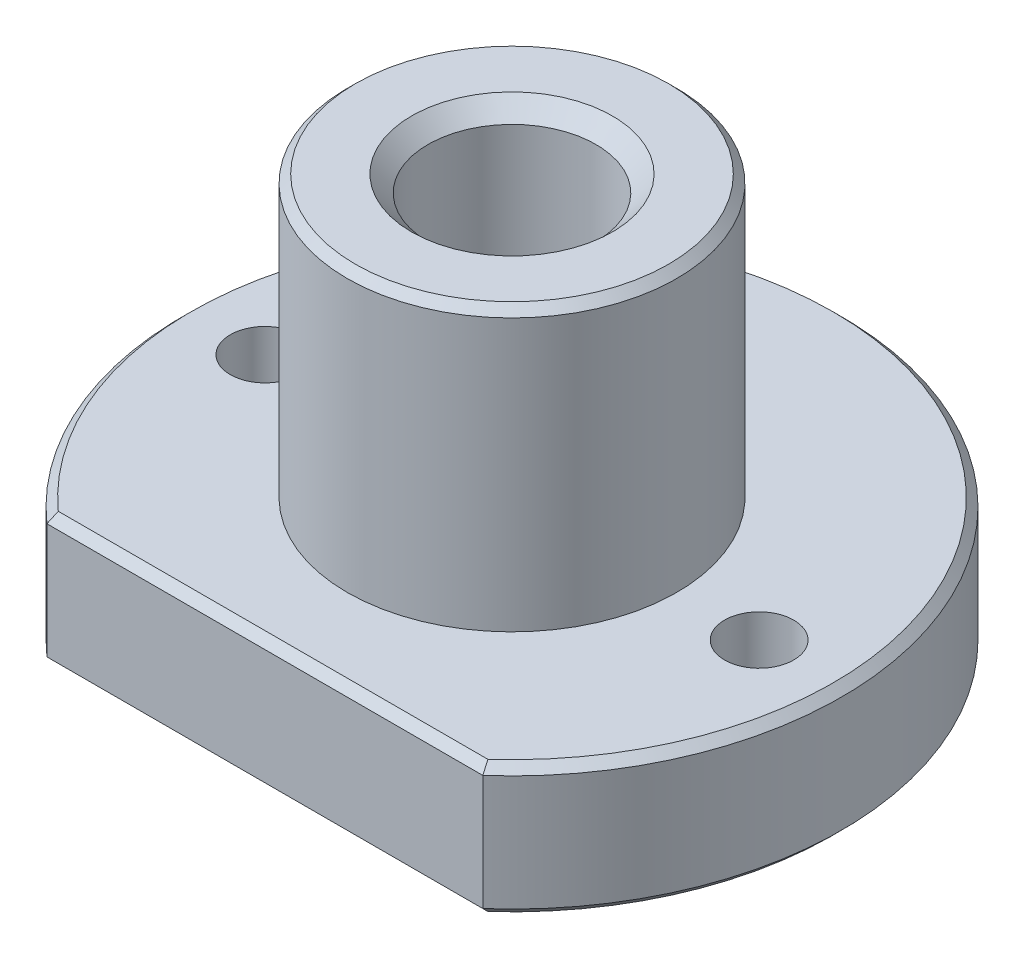
ISO-10303-21;
HEADER;
FILE_DESCRIPTION(('STEP AP214'),'2;1');
FILE_NAME('part.step','',(''),(''),'','','');
FILE_SCHEMA(('AUTOMOTIVE_DESIGN { 1 0 10303 214 1 1 1 1 }'));
ENDSEC;
DATA;
#1=APPLICATION_CONTEXT('core data for automotive mechanical design processes');
#2=APPLICATION_PROTOCOL_DEFINITION('international standard','automotive_design',2000,#1);
#3=PRODUCT_CONTEXT('',#1,'mechanical');
#4=PRODUCT('Part','Part','',(#3));
#5=PRODUCT_RELATED_PRODUCT_CATEGORY('part','',(#4));
#6=PRODUCT_DEFINITION_FORMATION('','',#4);
#7=PRODUCT_DEFINITION_CONTEXT('part definition',#1,'design');
#8=PRODUCT_DEFINITION('design','',#6,#7);
#9=PRODUCT_DEFINITION_SHAPE('','',#8);
#10=(LENGTH_UNIT() NAMED_UNIT(*) SI_UNIT(.MILLI.,.METRE.));
#11=(NAMED_UNIT(*) PLANE_ANGLE_UNIT() SI_UNIT($,.RADIAN.));
#12=(NAMED_UNIT(*) SI_UNIT($,.STERADIAN.) SOLID_ANGLE_UNIT());
#13=UNCERTAINTY_MEASURE_WITH_UNIT(LENGTH_MEASURE(1.E-05),#10,'distance_accuracy_value','');
#14=(GEOMETRIC_REPRESENTATION_CONTEXT(3) GLOBAL_UNCERTAINTY_ASSIGNED_CONTEXT((#13)) GLOBAL_UNIT_ASSIGNED_CONTEXT((#10,
#11,#12)) REPRESENTATION_CONTEXT('',''));
#15=CARTESIAN_POINT('',(0.,0.,0.));
#16=DIRECTION('',(0.,0.,1.));
#17=DIRECTION('',(1.,0.,0.));
#18=AXIS2_PLACEMENT_3D('',#15,#16,#17);
#19=CARTESIAN_POINT('',(0.,8.,0.));
#20=DIRECTION('',(0.,1.,0.));
#21=DIRECTION('',(0.,0.,1.));
#22=AXIS2_PLACEMENT_3D('',#19,#20,#21);
#23=PLANE('',#22);
#24=CARTESIAN_POINT('',(0.,8.,0.));
#25=DIRECTION('',(0.,1.,0.));
#26=DIRECTION('',(0.,0.,1.));
#27=AXIS2_PLACEMENT_3D('',#24,#25,#26);
#28=CIRCLE('',#27,19.5);
#29=CARTESIAN_POINT('',(13.0384048104053,8.,14.5));
#30=VERTEX_POINT('',#29);
#31=CARTESIAN_POINT('',(-13.0384048104053,8.,14.5));
#32=VERTEX_POINT('',#31);
#33=EDGE_CURVE('E48',#30,#32,#28,.T.);
#34=ORIENTED_EDGE('',*,*,#33,.T.);
#35=DIRECTION('',(1.,0.,0.));
#36=VECTOR('',#35,1.);
#37=CARTESIAN_POINT('',(13.228756555323,8.,14.5));
#38=LINE('',#37,#36);
#39=EDGE_CURVE('E11',#32,#30,#38,.T.);
#40=ORIENTED_EDGE('',*,*,#39,.T.);
#41=EDGE_LOOP('',(#34,#40));
#42=FACE_BOUND('',#41,.T.);
#43=CARTESIAN_POINT('',(-15.,8.,0.));
#44=DIRECTION('',(0.,1.,0.));
#45=DIRECTION('',(0.,0.,1.));
#46=AXIS2_PLACEMENT_3D('',#43,#44,#45);
#47=CIRCLE('',#46,2.09999999999999);
#48=CARTESIAN_POINT('',(-15.,8.,2.09999999999999));
#49=VERTEX_POINT('',#48);
#50=EDGE_CURVE('E114',#49,#49,#47,.T.);
#51=ORIENTED_EDGE('',*,*,#50,.F.);
#52=EDGE_LOOP('',(#51));
#53=FACE_BOUND('',#52,.T.);
#54=CARTESIAN_POINT('',(15.,8.,0.));
#55=DIRECTION('',(0.,1.,0.));
#56=DIRECTION('',(0.,0.,1.));
#57=AXIS2_PLACEMENT_3D('',#54,#55,#56);
#58=CIRCLE('',#57,2.09999999999999);
#59=CARTESIAN_POINT('',(15.,8.,2.09999999999998));
#60=VERTEX_POINT('',#59);
#61=EDGE_CURVE('E123',#60,#60,#58,.T.);
#62=ORIENTED_EDGE('',*,*,#61,.F.);
#63=EDGE_LOOP('',(#62));
#64=FACE_BOUND('',#63,.T.);
#65=CARTESIAN_POINT('',(0.,8.,0.));
#66=DIRECTION('',(0.,1.,0.));
#67=DIRECTION('',(0.,0.,1.));
#68=AXIS2_PLACEMENT_3D('',#65,#66,#67);
#69=CIRCLE('',#68,10.);
#70=CARTESIAN_POINT('',(0.,8.,10.));
#71=VERTEX_POINT('',#70);
#72=EDGE_CURVE('E129',#71,#71,#69,.T.);
#73=ORIENTED_EDGE('',*,*,#72,.F.);
#74=EDGE_LOOP('',(#73));
#75=FACE_BOUND('',#74,.T.);
#76=ADVANCED_FACE('F35',(#42,#53,#64,#75),#23,.T.);
#77=CARTESIAN_POINT('',(0.,8.,0.));
#78=DIRECTION('',(0.,-1.,0.));
#79=DIRECTION('',(0.,0.,-1.));
#80=AXIS2_PLACEMENT_3D('',#77,#78,#79);
#81=CYLINDRICAL_SURFACE('',#80,20.);
#82=DIRECTION('',(0.,-1.,0.));
#83=VECTOR('',#82,1.);
#84=CARTESIAN_POINT('',(13.228756555323,8.,15.));
#85=LINE('',#84,#83);
#86=CARTESIAN_POINT('',(13.228756555323,0.499999999999994,15.));
#87=VERTEX_POINT('',#86);
#88=CARTESIAN_POINT('',(13.228756555323,7.49999999999999,15.));
#89=VERTEX_POINT('',#88);
#90=EDGE_CURVE('E107',#87,#89,#85,.F.);
#91=ORIENTED_EDGE('',*,*,#90,.F.);
#92=CARTESIAN_POINT('',(0.,0.499999999999994,0.));
#93=DIRECTION('',(0.,1.,0.));
#94=DIRECTION('',(0.,0.,1.));
#95=AXIS2_PLACEMENT_3D('',#92,#93,#94);
#96=CIRCLE('',#95,20.);
#97=CARTESIAN_POINT('',(-13.228756555323,0.499999999999994,15.));
#98=VERTEX_POINT('',#97);
#99=EDGE_CURVE('E95',#87,#98,#96,.T.);
#100=ORIENTED_EDGE('',*,*,#99,.T.);
#101=DIRECTION('',(0.,-1.,0.));
#102=VECTOR('',#101,1.);
#103=CARTESIAN_POINT('',(-13.228756555323,8.,15.));
#104=LINE('',#103,#102);
#105=CARTESIAN_POINT('',(-13.228756555323,7.49999999999999,15.));
#106=VERTEX_POINT('',#105);
#107=EDGE_CURVE('E108',#106,#98,#104,.T.);
#108=ORIENTED_EDGE('',*,*,#107,.F.);
#109=CARTESIAN_POINT('',(0.,7.49999999999999,0.));
#110=DIRECTION('',(0.,1.,0.));
#111=DIRECTION('',(0.,0.,1.));
#112=AXIS2_PLACEMENT_3D('',#109,#110,#111);
#113=CIRCLE('',#112,20.);
#114=EDGE_CURVE('E101',#106,#89,#113,.F.);
#115=ORIENTED_EDGE('',*,*,#114,.T.);
#116=EDGE_LOOP('',(#91,#100,#108,#115));
#117=FACE_BOUND('',#116,.T.);
#118=ADVANCED_FACE('F112',(#117),#81,.T.);
#119=CARTESIAN_POINT('',(0.,0.,0.));
#120=DIRECTION('',(0.,1.,0.));
#121=DIRECTION('',(0.,0.,1.));
#122=AXIS2_PLACEMENT_3D('',#119,#120,#121);
#123=PLANE('',#122);
#124=CARTESIAN_POINT('',(0.,0.,0.));
#125=DIRECTION('',(0.,1.,0.));
#126=DIRECTION('',(0.,0.,1.));
#127=AXIS2_PLACEMENT_3D('',#124,#125,#126);
#128=CIRCLE('',#127,19.5);
#129=CARTESIAN_POINT('',(-13.0384048104053,0.,14.5));
#130=VERTEX_POINT('',#129);
#131=CARTESIAN_POINT('',(13.0384048104053,0.,14.5));
#132=VERTEX_POINT('',#131);
#133=EDGE_CURVE('E109',#130,#132,#128,.F.);
#134=ORIENTED_EDGE('',*,*,#133,.T.);
#135=DIRECTION('',(-1.,0.,0.));
#136=VECTOR('',#135,1.);
#137=CARTESIAN_POINT('',(0.,0.,14.5));
#138=LINE('',#137,#136);
#139=EDGE_CURVE('E89',#132,#130,#138,.T.);
#140=ORIENTED_EDGE('',*,*,#139,.T.);
#141=EDGE_LOOP('',(#134,#140));
#142=FACE_BOUND('',#141,.T.);
#143=CARTESIAN_POINT('',(-15.,0.,0.));
#144=DIRECTION('',(0.,1.,0.));
#145=DIRECTION('',(0.,0.,1.));
#146=AXIS2_PLACEMENT_3D('',#143,#144,#145);
#147=CIRCLE('',#146,2.09999999999999);
#148=CARTESIAN_POINT('',(-15.,0.,2.09999999999999));
#149=VERTEX_POINT('',#148);
#150=EDGE_CURVE('E117',#149,#149,#147,.T.);
#151=ORIENTED_EDGE('',*,*,#150,.T.);
#152=EDGE_LOOP('',(#151));
#153=FACE_BOUND('',#152,.T.);
#154=CARTESIAN_POINT('',(15.,0.,0.));
#155=DIRECTION('',(0.,1.,0.));
#156=DIRECTION('',(0.,0.,1.));
#157=AXIS2_PLACEMENT_3D('',#154,#155,#156);
#158=CIRCLE('',#157,2.09999999999999);
#159=CARTESIAN_POINT('',(15.,0.,2.09999999999999));
#160=VERTEX_POINT('',#159);
#161=EDGE_CURVE('E126',#160,#160,#158,.T.);
#162=ORIENTED_EDGE('',*,*,#161,.T.);
#163=EDGE_LOOP('',(#162));
#164=FACE_BOUND('',#163,.T.);
#165=CARTESIAN_POINT('',(0.,0.,0.));
#166=DIRECTION('',(0.,1.,0.));
#167=DIRECTION('',(0.,0.,1.));
#168=AXIS2_PLACEMENT_3D('',#165,#166,#167);
#169=CIRCLE('',#168,6.1);
#170=CARTESIAN_POINT('',(0.,0.,6.1));
#171=VERTEX_POINT('',#170);
#172=EDGE_CURVE('E132',#171,#171,#169,.T.);
#173=ORIENTED_EDGE('',*,*,#172,.T.);
#174=EDGE_LOOP('',(#173));
#175=FACE_BOUND('',#174,.T.);
#176=ADVANCED_FACE('F188',(#142,#153,#164,#175),#123,.F.);
#177=CARTESIAN_POINT('',(0.,25.,0.));
#178=DIRECTION('',(0.,-1.,0.));
#179=DIRECTION('',(0.,0.,-1.));
#180=AXIS2_PLACEMENT_3D('',#177,#178,#179);
#181=CYLINDRICAL_SURFACE('',#180,10.);
#182=CARTESIAN_POINT('',(0.,24.5,0.));
#183=DIRECTION('',(0.,1.,0.));
#184=DIRECTION('',(0.,0.,1.));
#185=AXIS2_PLACEMENT_3D('',#182,#183,#184);
#186=CIRCLE('',#185,10.);
#187=CARTESIAN_POINT('',(0.,24.5,10.));
#188=VERTEX_POINT('',#187);
#189=EDGE_CURVE('E147',#188,#188,#186,.F.);
#190=ORIENTED_EDGE('',*,*,#189,.T.);
#191=EDGE_LOOP('',(#190));
#192=FACE_BOUND('',#191,.T.);
#193=ORIENTED_EDGE('',*,*,#72,.T.);
#194=EDGE_LOOP('',(#193));
#195=FACE_BOUND('',#194,.T.);
#196=ADVANCED_FACE('F185',(#192,#195),#181,.T.);
#197=CARTESIAN_POINT('',(0.,25.,0.));
#198=DIRECTION('',(0.,1.,0.));
#199=DIRECTION('',(0.,0.,1.));
#200=AXIS2_PLACEMENT_3D('',#197,#198,#199);
#201=PLANE('',#200);
#202=CARTESIAN_POINT('',(0.,25.,0.));
#203=DIRECTION('',(0.,1.,0.));
#204=DIRECTION('',(0.,0.,1.));
#205=AXIS2_PLACEMENT_3D('',#202,#203,#204);
#206=CIRCLE('',#205,9.49999999999998);
#207=CARTESIAN_POINT('',(0.,25.,9.49999999999998));
#208=VERTEX_POINT('',#207);
#209=EDGE_CURVE('E144',#208,#208,#206,.T.);
#210=ORIENTED_EDGE('',*,*,#209,.T.);
#211=EDGE_LOOP('',(#210));
#212=FACE_BOUND('',#211,.T.);
#213=CARTESIAN_POINT('',(0.,25.,0.));
#214=DIRECTION('',(0.,1.,0.));
#215=DIRECTION('',(0.,0.,1.));
#216=AXIS2_PLACEMENT_3D('',#213,#214,#215);
#217=CIRCLE('',#216,6.1);
#218=CARTESIAN_POINT('',(0.,25.,6.1));
#219=VERTEX_POINT('',#218);
#220=EDGE_CURVE('E141',#219,#219,#217,.F.);
#221=ORIENTED_EDGE('',*,*,#220,.T.);
#222=EDGE_LOOP('',(#221));
#223=FACE_BOUND('',#222,.T.);
#224=ADVANCED_FACE('F187',(#212,#223),#201,.T.);
#225=CARTESIAN_POINT('',(0.,25.,0.));
#226=DIRECTION('',(0.,1.,0.));
#227=DIRECTION('',(0.,0.,1.));
#228=AXIS2_PLACEMENT_3D('',#225,#226,#227);
#229=CYLINDRICAL_SURFACE('',#228,5.1);
#230=CARTESIAN_POINT('',(0.,1.00000000000001,0.));
#231=DIRECTION('',(0.,1.,0.));
#232=DIRECTION('',(0.,0.,1.));
#233=AXIS2_PLACEMENT_3D('',#230,#231,#232);
#234=CIRCLE('',#233,5.1);
#235=CARTESIAN_POINT('',(0.,1.00000000000001,5.1));
#236=VERTEX_POINT('',#235);
#237=EDGE_CURVE('E138',#236,#236,#234,.F.);
#238=ORIENTED_EDGE('',*,*,#237,.T.);
#239=EDGE_LOOP('',(#238));
#240=FACE_BOUND('',#239,.T.);
#241=CARTESIAN_POINT('',(0.,24.,0.));
#242=DIRECTION('',(0.,1.,0.));
#243=DIRECTION('',(0.,0.,1.));
#244=AXIS2_PLACEMENT_3D('',#241,#242,#243);
#245=CIRCLE('',#244,5.1);
#246=CARTESIAN_POINT('',(0.,24.,5.1));
#247=VERTEX_POINT('',#246);
#248=EDGE_CURVE('E135',#247,#247,#245,.T.);
#249=ORIENTED_EDGE('',*,*,#248,.T.);
#250=EDGE_LOOP('',(#249));
#251=FACE_BOUND('',#250,.T.);
#252=ADVANCED_FACE('F195',(#240,#251),#229,.F.);
#253=CARTESIAN_POINT('',(0.,0.,0.));
#254=DIRECTION('',(0.,-1.,0.));
#255=DIRECTION('',(0.,0.,-1.));
#256=AXIS2_PLACEMENT_3D('',#253,#254,#255);
#257=CONICAL_SURFACE('',#256,6.1,0.785398163397444);
#258=ORIENTED_EDGE('',*,*,#237,.F.);
#259=EDGE_LOOP('',(#258));
#260=FACE_BOUND('',#259,.T.);
#261=ORIENTED_EDGE('',*,*,#172,.F.);
#262=EDGE_LOOP('',(#261));
#263=FACE_BOUND('',#262,.T.);
#264=ADVANCED_FACE('F204',(#260,#263),#257,.F.);
#265=CARTESIAN_POINT('',(0.,24.,0.));
#266=DIRECTION('',(0.,1.,0.));
#267=DIRECTION('',(0.,0.,1.));
#268=AXIS2_PLACEMENT_3D('',#265,#266,#267);
#269=CONICAL_SURFACE('',#268,5.1,0.785398163397451);
#270=ORIENTED_EDGE('',*,*,#220,.F.);
#271=EDGE_LOOP('',(#270));
#272=FACE_BOUND('',#271,.T.);
#273=ORIENTED_EDGE('',*,*,#248,.F.);
#274=EDGE_LOOP('',(#273));
#275=FACE_BOUND('',#274,.T.);
#276=ADVANCED_FACE('F207',(#272,#275),#269,.F.);
#277=CARTESIAN_POINT('',(15.,8.,0.));
#278=DIRECTION('',(0.,1.,0.));
#279=DIRECTION('',(0.,0.,1.));
#280=AXIS2_PLACEMENT_3D('',#277,#278,#279);
#281=CYLINDRICAL_SURFACE('',#280,2.09999999999999);
#282=ORIENTED_EDGE('',*,*,#161,.F.);
#283=EDGE_LOOP('',(#282));
#284=FACE_BOUND('',#283,.T.);
#285=ORIENTED_EDGE('',*,*,#61,.T.);
#286=EDGE_LOOP('',(#285));
#287=FACE_BOUND('',#286,.T.);
#288=ADVANCED_FACE('F210',(#284,#287),#281,.F.);
#289=CARTESIAN_POINT('',(-15.,8.,0.));
#290=DIRECTION('',(0.,1.,0.));
#291=DIRECTION('',(0.,0.,1.));
#292=AXIS2_PLACEMENT_3D('',#289,#290,#291);
#293=CYLINDRICAL_SURFACE('',#292,2.09999999999999);
#294=ORIENTED_EDGE('',*,*,#150,.F.);
#295=EDGE_LOOP('',(#294));
#296=FACE_BOUND('',#295,.T.);
#297=ORIENTED_EDGE('',*,*,#50,.T.);
#298=EDGE_LOOP('',(#297));
#299=FACE_BOUND('',#298,.T.);
#300=ADVANCED_FACE('F219',(#296,#299),#293,.F.);
#301=CARTESIAN_POINT('',(-22.5763606798921,25.001,15.));
#302=DIRECTION('',(0.,0.,-1.));
#303=DIRECTION('',(-1.,0.,0.));
#304=AXIS2_PLACEMENT_3D('',#301,#302,#303);
#305=PLANE('',#304);
#306=ORIENTED_EDGE('',*,*,#107,.T.);
#307=DIRECTION('',(1.,0.,0.));
#308=VECTOR('',#307,1.);
#309=CARTESIAN_POINT('',(-22.5763606798921,0.499999999999994,15.));
#310=LINE('',#309,#308);
#311=EDGE_CURVE('E87',#98,#87,#310,.T.);
#312=ORIENTED_EDGE('',*,*,#311,.T.);
#313=ORIENTED_EDGE('',*,*,#90,.T.);
#314=DIRECTION('',(-1.,0.,0.));
#315=VECTOR('',#314,1.);
#316=CARTESIAN_POINT('',(-13.228756555323,7.49999999999999,15.));
#317=LINE('',#316,#315);
#318=EDGE_CURVE('E110',#89,#106,#317,.T.);
#319=ORIENTED_EDGE('',*,*,#318,.T.);
#320=EDGE_LOOP('',(#306,#312,#313,#319));
#321=FACE_BOUND('',#320,.T.);
#322=ADVANCED_FACE('F105',(#321),#305,.F.);
#323=CARTESIAN_POINT('',(0.,25.,0.));
#324=DIRECTION('',(0.,-1.,0.));
#325=DIRECTION('',(0.,0.,-1.));
#326=AXIS2_PLACEMENT_3D('',#323,#324,#325);
#327=CONICAL_SURFACE('',#326,9.49999999999998,0.785398163397443);
#328=ORIENTED_EDGE('',*,*,#189,.F.);
#329=EDGE_LOOP('',(#328));
#330=FACE_BOUND('',#329,.T.);
#331=ORIENTED_EDGE('',*,*,#209,.F.);
#332=EDGE_LOOP('',(#331));
#333=FACE_BOUND('',#332,.T.);
#334=ADVANCED_FACE('F212',(#330,#333),#327,.T.);
#335=CARTESIAN_POINT('',(0.,0.499999999999994,0.));
#336=DIRECTION('',(0.,1.,0.));
#337=DIRECTION('',(0.,0.,1.));
#338=AXIS2_PLACEMENT_3D('',#335,#336,#337);
#339=CONICAL_SURFACE('',#338,20.,0.785398163397455);
#340=CARTESIAN_POINT('',(13.228756555323,0.499999999999994,15.));
#341=CARTESIAN_POINT('',(13.1972456329561,0.416625862193426,14.9166258621934));
#342=CARTESIAN_POINT('',(13.16562752653,0.333272127059542,14.8332721270595));
#343=CARTESIAN_POINT('',(13.1021769448953,0.166605460392023,14.666605460392));
#344=CARTESIAN_POINT('',(13.0703444696821,0.0832925288592427,14.5832925288592));
#345=CARTESIAN_POINT('',(13.0384048104053,0.,14.5));
#346=B_SPLINE_CURVE_WITH_KNOTS('',3,(#340,#341,#342,#343,#344,#345),.UNSPECIFIED.,.F.,.F.,(4,2,
4),(0.,0.366140075353097,0.732280158373685),.UNSPECIFIED.);
#347=EDGE_CURVE('E83',#132,#87,#346,.F.);
#348=ORIENTED_EDGE('',*,*,#347,.F.);
#349=ORIENTED_EDGE('',*,*,#133,.F.);
#350=CARTESIAN_POINT('',(-13.0384048104053,0.,14.5));
#351=CARTESIAN_POINT('',(-13.0703444696821,0.0832925288592421,14.5832925288592));
#352=CARTESIAN_POINT('',(-13.1021769448953,0.166605460392022,14.666605460392));
#353=CARTESIAN_POINT('',(-13.16562752653,0.333272127059541,14.8332721270595));
#354=CARTESIAN_POINT('',(-13.1972456329561,0.416625862193425,14.9166258621934));
#355=CARTESIAN_POINT('',(-13.228756555323,0.499999999999993,15.));
#356=B_SPLINE_CURVE_WITH_KNOTS('',3,(#350,#351,#352,#353,#354,#355),.UNSPECIFIED.,.F.,.F.,(4,2,
4),(0.,0.366140083020589,0.732280158373687),.UNSPECIFIED.);
#357=EDGE_CURVE('E92',#98,#130,#356,.F.);
#358=ORIENTED_EDGE('',*,*,#357,.F.);
#359=ORIENTED_EDGE('',*,*,#99,.F.);
#360=EDGE_LOOP('',(#348,#349,#358,#359));
#361=FACE_BOUND('',#360,.T.);
#362=ADVANCED_FACE('F96',(#361),#339,.T.);
#363=CARTESIAN_POINT('',(-22.5763606798921,0.499999999999994,15.));
#364=DIRECTION('',(0.,0.707106781186552,-0.707106781186543));
#365=DIRECTION('',(0.,0.707106781186543,0.707106781186552));
#366=AXIS2_PLACEMENT_3D('',#363,#364,#365);
#367=PLANE('',#366);
#368=ORIENTED_EDGE('',*,*,#357,.T.);
#369=ORIENTED_EDGE('',*,*,#139,.F.);
#370=ORIENTED_EDGE('',*,*,#347,.T.);
#371=ORIENTED_EDGE('',*,*,#311,.F.);
#372=EDGE_LOOP('',(#368,#369,#370,#371));
#373=FACE_BOUND('',#372,.T.);
#374=ADVANCED_FACE('F85',(#373),#367,.F.);
#375=CARTESIAN_POINT('',(0.,8.,0.));
#376=DIRECTION('',(0.,-1.,0.));
#377=DIRECTION('',(0.,0.,-1.));
#378=AXIS2_PLACEMENT_3D('',#375,#376,#377);
#379=CONICAL_SURFACE('',#378,19.5,0.785398163397445);
#380=CARTESIAN_POINT('',(13.0384048104053,8.,14.5));
#381=CARTESIAN_POINT('',(13.0703444696821,7.91670747114076,14.5832925288592));
#382=CARTESIAN_POINT('',(13.1021769448953,7.83339453960797,14.666605460392));
#383=CARTESIAN_POINT('',(13.16562752653,7.66672787294045,14.8332721270595));
#384=CARTESIAN_POINT('',(13.1972456329561,7.58337413780656,14.9166258621934));
#385=CARTESIAN_POINT('',(13.228756555323,7.49999999999999,15.));
#386=B_SPLINE_CURVE_WITH_KNOTS('',3,(#380,#381,#382,#383,#384,#385),.UNSPECIFIED.,.F.,.F.,(4,2,
4),(0.,0.366140083020596,0.732280158373699),.UNSPECIFIED.);
#387=EDGE_CURVE('E61',#89,#30,#386,.F.);
#388=ORIENTED_EDGE('',*,*,#387,.F.);
#389=ORIENTED_EDGE('',*,*,#114,.F.);
#390=CARTESIAN_POINT('',(-13.228756555323,7.49999999999999,15.));
#391=CARTESIAN_POINT('',(-13.1972456329561,7.58337413780656,14.9166258621934));
#392=CARTESIAN_POINT('',(-13.16562752653,7.66672787294045,14.8332721270595));
#393=CARTESIAN_POINT('',(-13.1021769448953,7.83339453960797,14.666605460392));
#394=CARTESIAN_POINT('',(-13.0703444696821,7.91670747114075,14.5832925288592));
#395=CARTESIAN_POINT('',(-13.0384048104053,8.,14.5));
#396=B_SPLINE_CURVE_WITH_KNOTS('',3,(#390,#391,#392,#393,#394,#395),.UNSPECIFIED.,.F.,.F.,(4,2,
4),(0.,0.366140075353102,0.732280158373697),.UNSPECIFIED.);
#397=EDGE_CURVE('E40',#32,#106,#396,.F.);
#398=ORIENTED_EDGE('',*,*,#397,.F.);
#399=ORIENTED_EDGE('',*,*,#33,.F.);
#400=EDGE_LOOP('',(#388,#389,#398,#399));
#401=FACE_BOUND('',#400,.T.);
#402=ADVANCED_FACE('F167',(#401),#379,.T.);
#403=CARTESIAN_POINT('',(0.,8.,14.5));
#404=DIRECTION('',(0.,0.707106781186545,0.70710678118655));
#405=DIRECTION('',(0.,-0.70710678118655,0.707106781186545));
#406=AXIS2_PLACEMENT_3D('',#403,#404,#405);
#407=PLANE('',#406);
#408=ORIENTED_EDGE('',*,*,#397,.T.);
#409=ORIENTED_EDGE('',*,*,#318,.F.);
#410=ORIENTED_EDGE('',*,*,#387,.T.);
#411=ORIENTED_EDGE('',*,*,#39,.F.);
#412=EDGE_LOOP('',(#408,#409,#410,#411));
#413=FACE_BOUND('',#412,.T.);
#414=ADVANCED_FACE('F37',(#413),#407,.T.);
#415=CLOSED_SHELL('',(#76,#118,#176,#196,#224,#252,#264,#276,#288,#300,#322,#334,#362,#374,#402,#414));
#416=MANIFOLD_SOLID_BREP('B2',#415);
#417=ADVANCED_BREP_SHAPE_REPRESENTATION('',(#18,#416),#14);
#418=SHAPE_DEFINITION_REPRESENTATION(#9,#417);
ENDSEC;
END-ISO-10303-21;
